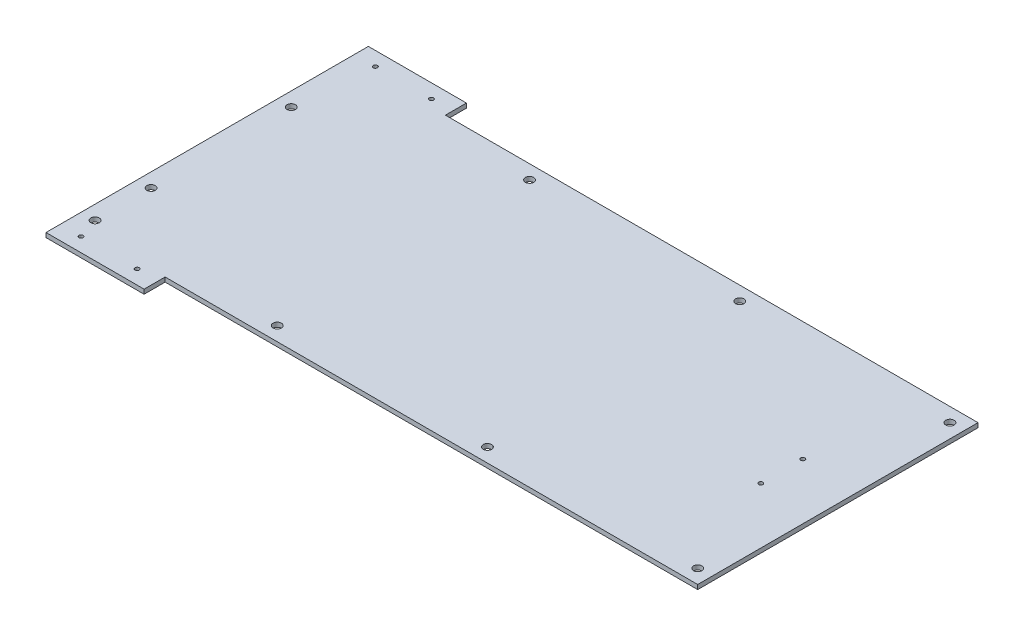
ISO-10303-21;
HEADER;
FILE_DESCRIPTION(('STEP AP214'),'2;1');
FILE_NAME('part.step','',(''),(''),'','','');
FILE_SCHEMA(('AUTOMOTIVE_DESIGN { 1 0 10303 214 1 1 1 1 }'));
ENDSEC;
DATA;
#1=APPLICATION_CONTEXT('core data for automotive mechanical design processes');
#2=APPLICATION_PROTOCOL_DEFINITION('international standard','automotive_design',2000,#1);
#3=PRODUCT_CONTEXT('',#1,'mechanical');
#4=PRODUCT('Part','Part','',(#3));
#5=PRODUCT_RELATED_PRODUCT_CATEGORY('part','',(#4));
#6=PRODUCT_DEFINITION_FORMATION('','',#4);
#7=PRODUCT_DEFINITION_CONTEXT('part definition',#1,'design');
#8=PRODUCT_DEFINITION('design','',#6,#7);
#9=PRODUCT_DEFINITION_SHAPE('','',#8);
#10=(LENGTH_UNIT() NAMED_UNIT(*) SI_UNIT(.MILLI.,.METRE.));
#11=(NAMED_UNIT(*) PLANE_ANGLE_UNIT() SI_UNIT($,.RADIAN.));
#12=(NAMED_UNIT(*) SI_UNIT($,.STERADIAN.) SOLID_ANGLE_UNIT());
#13=UNCERTAINTY_MEASURE_WITH_UNIT(LENGTH_MEASURE(1.E-05),#10,'distance_accuracy_value','');
#14=(GEOMETRIC_REPRESENTATION_CONTEXT(3) GLOBAL_UNCERTAINTY_ASSIGNED_CONTEXT((#13)) GLOBAL_UNIT_ASSIGNED_CONTEXT((#10,
#11,#12)) REPRESENTATION_CONTEXT('',''));
#15=CARTESIAN_POINT('',(0.,0.,0.));
#16=DIRECTION('',(0.,0.,1.));
#17=DIRECTION('',(1.,0.,0.));
#18=AXIS2_PLACEMENT_3D('',#15,#16,#17);
#19=CARTESIAN_POINT('',(0.,3.175,0.));
#20=DIRECTION('',(0.,-1.,0.));
#21=DIRECTION('',(0.,0.,-1.));
#22=AXIS2_PLACEMENT_3D('',#19,#20,#21);
#23=PLANE('',#22);
#24=DIRECTION('',(0.,0.,-1.));
#25=VECTOR('',#24,1.);
#26=CARTESIAN_POINT('',(450.,3.175,-110.468098834596));
#27=LINE('',#26,#25);
#28=CARTESIAN_POINT('',(450.,3.175,-110.468098834596));
#29=VERTEX_POINT('',#28);
#30=CARTESIAN_POINT('',(450.,3.175,-310.468098834596));
#31=VERTEX_POINT('',#30);
#32=EDGE_CURVE('E148',#29,#31,#27,.T.);
#33=ORIENTED_EDGE('',*,*,#32,.T.);
#34=DIRECTION('',(-1.,0.,0.));
#35=VECTOR('',#34,1.);
#36=CARTESIAN_POINT('',(70.,3.175,-310.468098834596));
#37=LINE('',#36,#35);
#38=CARTESIAN_POINT('',(70.,3.175,-310.468098834596));
#39=VERTEX_POINT('',#38);
#40=EDGE_CURVE('E96',#31,#39,#37,.T.);
#41=ORIENTED_EDGE('',*,*,#40,.T.);
#42=DIRECTION('',(0.,0.,-1.));
#43=VECTOR('',#42,1.);
#44=CARTESIAN_POINT('',(70.,3.175,-325.468098834596));
#45=LINE('',#44,#43);
#46=CARTESIAN_POINT('',(70.,3.175,-325.468098834596));
#47=VERTEX_POINT('',#46);
#48=EDGE_CURVE('E163',#39,#47,#45,.T.);
#49=ORIENTED_EDGE('',*,*,#48,.T.);
#50=DIRECTION('',(-1.,0.,0.));
#51=VECTOR('',#50,1.);
#52=CARTESIAN_POINT('',(0.,3.175,-325.468098834596));
#53=LINE('',#52,#51);
#54=CARTESIAN_POINT('',(0.,3.175,-325.468098834596));
#55=VERTEX_POINT('',#54);
#56=EDGE_CURVE('E176',#47,#55,#53,.T.);
#57=ORIENTED_EDGE('',*,*,#56,.T.);
#58=DIRECTION('',(0.,0.,1.));
#59=VECTOR('',#58,1.);
#60=CARTESIAN_POINT('',(0.,3.175,-95.4680988345958));
#61=LINE('',#60,#59);
#62=CARTESIAN_POINT('',(0.,3.175,-95.4680988345958));
#63=VERTEX_POINT('',#62);
#64=EDGE_CURVE('E115',#55,#63,#61,.T.);
#65=ORIENTED_EDGE('',*,*,#64,.T.);
#66=DIRECTION('',(1.,0.,0.));
#67=VECTOR('',#66,1.);
#68=CARTESIAN_POINT('',(0.,3.175,-95.4680988345958));
#69=LINE('',#68,#67);
#70=CARTESIAN_POINT('',(70.,3.175,-95.4680988345958));
#71=VERTEX_POINT('',#70);
#72=EDGE_CURVE('E109',#63,#71,#69,.T.);
#73=ORIENTED_EDGE('',*,*,#72,.T.);
#74=DIRECTION('',(0.,0.,-1.));
#75=VECTOR('',#74,1.);
#76=CARTESIAN_POINT('',(70.,3.175,-95.4680988345958));
#77=LINE('',#76,#75);
#78=CARTESIAN_POINT('',(70.,3.175,-110.468098834596));
#79=VERTEX_POINT('',#78);
#80=EDGE_CURVE('E113',#71,#79,#77,.T.);
#81=ORIENTED_EDGE('',*,*,#80,.T.);
#82=DIRECTION('',(1.,0.,0.));
#83=VECTOR('',#82,1.);
#84=CARTESIAN_POINT('',(70.,3.175,-110.468098834596));
#85=LINE('',#84,#83);
#86=EDGE_CURVE('E53',#79,#29,#85,.T.);
#87=ORIENTED_EDGE('',*,*,#86,.T.);
#88=EDGE_LOOP('',(#33,#41,#49,#57,#65,#73,#81,#87));
#89=FACE_BOUND('',#88,.T.);
#90=CARTESIAN_POINT('',(55.,3.175,-315.468098834596));
#91=DIRECTION('',(0.,1.,0.));
#92=DIRECTION('',(0.,0.,1.));
#93=AXIS2_PLACEMENT_3D('',#90,#91,#92);
#94=CIRCLE('',#93,1.5);
#95=CARTESIAN_POINT('',(55.,3.175,-313.968098834596));
#96=VERTEX_POINT('',#95);
#97=EDGE_CURVE('E137',#96,#96,#94,.T.);
#98=ORIENTED_EDGE('',*,*,#97,.F.);
#99=EDGE_LOOP('',(#98));
#100=FACE_BOUND('',#99,.T.);
#101=CARTESIAN_POINT('',(15.,3.175,-315.468098834596));
#102=DIRECTION('',(0.,1.,0.));
#103=DIRECTION('',(0.,0.,1.));
#104=AXIS2_PLACEMENT_3D('',#101,#102,#103);
#105=CIRCLE('',#104,1.5);
#106=CARTESIAN_POINT('',(15.,3.175,-313.968098834596));
#107=VERTEX_POINT('',#106);
#108=EDGE_CURVE('E185',#107,#107,#105,.T.);
#109=ORIENTED_EDGE('',*,*,#108,.F.);
#110=EDGE_LOOP('',(#109));
#111=FACE_BOUND('',#110,.T.);
#112=CARTESIAN_POINT('',(55.,3.175,-105.468098834596));
#113=DIRECTION('',(0.,1.,0.));
#114=DIRECTION('',(0.,0.,1.));
#115=AXIS2_PLACEMENT_3D('',#112,#113,#114);
#116=CIRCLE('',#115,1.5);
#117=CARTESIAN_POINT('',(55.,3.175,-103.968098834596));
#118=VERTEX_POINT('',#117);
#119=EDGE_CURVE('E191',#118,#118,#116,.T.);
#120=ORIENTED_EDGE('',*,*,#119,.F.);
#121=EDGE_LOOP('',(#120));
#122=FACE_BOUND('',#121,.T.);
#123=CARTESIAN_POINT('',(15.,3.175,-105.468098834596));
#124=DIRECTION('',(0.,1.,0.));
#125=DIRECTION('',(0.,0.,1.));
#126=AXIS2_PLACEMENT_3D('',#123,#124,#125);
#127=CIRCLE('',#126,1.5);
#128=CARTESIAN_POINT('',(15.,3.175,-103.968098834596));
#129=VERTEX_POINT('',#128);
#130=EDGE_CURVE('E197',#129,#129,#127,.T.);
#131=ORIENTED_EDGE('',*,*,#130,.F.);
#132=EDGE_LOOP('',(#131));
#133=FACE_BOUND('',#132,.T.);
#134=CARTESIAN_POINT('',(410.,3.175,-225.468098834596));
#135=DIRECTION('',(0.,1.,0.));
#136=DIRECTION('',(0.,0.,1.));
#137=AXIS2_PLACEMENT_3D('',#134,#135,#136);
#138=CIRCLE('',#137,1.50000000000002);
#139=CARTESIAN_POINT('',(410.,3.175,-223.968098834596));
#140=VERTEX_POINT('',#139);
#141=EDGE_CURVE('E203',#140,#140,#138,.T.);
#142=ORIENTED_EDGE('',*,*,#141,.F.);
#143=EDGE_LOOP('',(#142));
#144=FACE_BOUND('',#143,.T.);
#145=CARTESIAN_POINT('',(410.,3.175,-195.468098834596));
#146=DIRECTION('',(0.,1.,0.));
#147=DIRECTION('',(0.,0.,1.));
#148=AXIS2_PLACEMENT_3D('',#145,#146,#147);
#149=CIRCLE('',#148,1.50000000000002);
#150=CARTESIAN_POINT('',(410.,3.175,-193.968098834596));
#151=VERTEX_POINT('',#150);
#152=EDGE_CURVE('E209',#151,#151,#149,.T.);
#153=ORIENTED_EDGE('',*,*,#152,.F.);
#154=EDGE_LOOP('',(#153));
#155=FACE_BOUND('',#154,.T.);
#156=CARTESIAN_POINT('',(10.,3.175,-260.468098834596));
#157=DIRECTION('',(0.,1.,0.));
#158=DIRECTION('',(0.,0.,1.));
#159=AXIS2_PLACEMENT_3D('',#156,#157,#158);
#160=CIRCLE('',#159,3.);
#161=CARTESIAN_POINT('',(10.,3.175,-257.468098834596));
#162=VERTEX_POINT('',#161);
#163=EDGE_CURVE('E215',#162,#162,#160,.T.);
#164=ORIENTED_EDGE('',*,*,#163,.F.);
#165=EDGE_LOOP('',(#164));
#166=FACE_BOUND('',#165,.T.);
#167=CARTESIAN_POINT('',(440.,3.175,-300.468098834596));
#168=DIRECTION('',(0.,1.,0.));
#169=DIRECTION('',(0.,0.,1.));
#170=AXIS2_PLACEMENT_3D('',#167,#168,#169);
#171=CIRCLE('',#170,2.99999999999999);
#172=CARTESIAN_POINT('',(440.,3.175,-297.468098834596));
#173=VERTEX_POINT('',#172);
#174=EDGE_CURVE('E221',#173,#173,#171,.T.);
#175=ORIENTED_EDGE('',*,*,#174,.F.);
#176=EDGE_LOOP('',(#175));
#177=FACE_BOUND('',#176,.T.);
#178=CARTESIAN_POINT('',(140.,3.175,-300.468098834596));
#179=DIRECTION('',(0.,1.,0.));
#180=DIRECTION('',(0.,0.,1.));
#181=AXIS2_PLACEMENT_3D('',#178,#179,#180);
#182=CIRCLE('',#181,2.99999999999999);
#183=CARTESIAN_POINT('',(140.,3.175,-297.468098834596));
#184=VERTEX_POINT('',#183);
#185=EDGE_CURVE('E227',#184,#184,#182,.T.);
#186=ORIENTED_EDGE('',*,*,#185,.F.);
#187=EDGE_LOOP('',(#186));
#188=FACE_BOUND('',#187,.T.);
#189=CARTESIAN_POINT('',(290.,3.175,-300.468098834596));
#190=DIRECTION('',(0.,1.,0.));
#191=DIRECTION('',(0.,0.,1.));
#192=AXIS2_PLACEMENT_3D('',#189,#190,#191);
#193=CIRCLE('',#192,2.99999999999999);
#194=CARTESIAN_POINT('',(290.,3.175,-297.468098834596));
#195=VERTEX_POINT('',#194);
#196=EDGE_CURVE('E233',#195,#195,#193,.T.);
#197=ORIENTED_EDGE('',*,*,#196,.F.);
#198=EDGE_LOOP('',(#197));
#199=FACE_BOUND('',#198,.T.);
#200=CARTESIAN_POINT('',(440.,3.175,-120.468098834596));
#201=DIRECTION('',(0.,1.,0.));
#202=DIRECTION('',(0.,0.,-1.));
#203=AXIS2_PLACEMENT_3D('',#200,#201,#202);
#204=CIRCLE('',#203,2.99999999999999);
#205=CARTESIAN_POINT('',(440.,3.175,-123.468098834596));
#206=VERTEX_POINT('',#205);
#207=EDGE_CURVE('E239',#206,#206,#204,.T.);
#208=ORIENTED_EDGE('',*,*,#207,.F.);
#209=EDGE_LOOP('',(#208));
#210=FACE_BOUND('',#209,.T.);
#211=CARTESIAN_POINT('',(290.,3.175,-120.468098834596));
#212=DIRECTION('',(0.,1.,0.));
#213=DIRECTION('',(0.,0.,-1.));
#214=AXIS2_PLACEMENT_3D('',#211,#212,#213);
#215=CIRCLE('',#214,2.99999999999999);
#216=CARTESIAN_POINT('',(290.,3.175,-123.468098834596));
#217=VERTEX_POINT('',#216);
#218=EDGE_CURVE('E245',#217,#217,#215,.T.);
#219=ORIENTED_EDGE('',*,*,#218,.F.);
#220=EDGE_LOOP('',(#219));
#221=FACE_BOUND('',#220,.T.);
#222=CARTESIAN_POINT('',(140.,3.175,-120.468098834596));
#223=DIRECTION('',(0.,1.,0.));
#224=DIRECTION('',(0.,0.,-1.));
#225=AXIS2_PLACEMENT_3D('',#222,#223,#224);
#226=CIRCLE('',#225,2.99999999999999);
#227=CARTESIAN_POINT('',(140.,3.175,-123.468098834596));
#228=VERTEX_POINT('',#227);
#229=EDGE_CURVE('E251',#228,#228,#226,.T.);
#230=ORIENTED_EDGE('',*,*,#229,.F.);
#231=EDGE_LOOP('',(#230));
#232=FACE_BOUND('',#231,.T.);
#233=CARTESIAN_POINT('',(9.99999999999999,3.175,-120.468098834596));
#234=DIRECTION('',(0.,1.,0.));
#235=DIRECTION('',(0.,0.,-1.));
#236=AXIS2_PLACEMENT_3D('',#233,#234,#235);
#237=CIRCLE('',#236,3.);
#238=CARTESIAN_POINT('',(9.99999999999999,3.175,-123.468098834596));
#239=VERTEX_POINT('',#238);
#240=EDGE_CURVE('E257',#239,#239,#237,.T.);
#241=ORIENTED_EDGE('',*,*,#240,.F.);
#242=EDGE_LOOP('',(#241));
#243=FACE_BOUND('',#242,.T.);
#244=CARTESIAN_POINT('',(10.,3.175,-160.468098834596));
#245=DIRECTION('',(0.,1.,0.));
#246=DIRECTION('',(0.,0.,-1.));
#247=AXIS2_PLACEMENT_3D('',#244,#245,#246);
#248=CIRCLE('',#247,3.);
#249=CARTESIAN_POINT('',(10.,3.175,-163.468098834596));
#250=VERTEX_POINT('',#249);
#251=EDGE_CURVE('E263',#250,#250,#248,.T.);
#252=ORIENTED_EDGE('',*,*,#251,.F.);
#253=EDGE_LOOP('',(#252));
#254=FACE_BOUND('',#253,.T.);
#255=ADVANCED_FACE('F36',(#89,#100,#111,#122,#133,#144,#155,#166,#177,#188,#199,#210,#221,#232,
#243,#254),#23,.F.);
#256=CARTESIAN_POINT('',(0.,0.,0.));
#257=DIRECTION('',(0.,-1.,0.));
#258=DIRECTION('',(0.,0.,-1.));
#259=AXIS2_PLACEMENT_3D('',#256,#257,#258);
#260=PLANE('',#259);
#261=CARTESIAN_POINT('',(9.99999999999999,0.,-120.468098834596));
#262=DIRECTION('',(0.,1.,0.));
#263=DIRECTION('',(0.,0.,-1.));
#264=AXIS2_PLACEMENT_3D('',#261,#262,#263);
#265=CIRCLE('',#264,3.);
#266=CARTESIAN_POINT('',(9.99999999999999,0.,-123.468098834596));
#267=VERTEX_POINT('',#266);
#268=EDGE_CURVE('E260',#267,#267,#265,.T.);
#269=ORIENTED_EDGE('',*,*,#268,.T.);
#270=EDGE_LOOP('',(#269));
#271=FACE_BOUND('',#270,.T.);
#272=CARTESIAN_POINT('',(290.,0.,-120.468098834596));
#273=DIRECTION('',(0.,1.,0.));
#274=DIRECTION('',(0.,0.,-1.));
#275=AXIS2_PLACEMENT_3D('',#272,#273,#274);
#276=CIRCLE('',#275,2.99999999999999);
#277=CARTESIAN_POINT('',(290.,0.,-123.468098834596));
#278=VERTEX_POINT('',#277);
#279=EDGE_CURVE('E248',#278,#278,#276,.T.);
#280=ORIENTED_EDGE('',*,*,#279,.T.);
#281=EDGE_LOOP('',(#280));
#282=FACE_BOUND('',#281,.T.);
#283=CARTESIAN_POINT('',(290.,0.,-300.468098834596));
#284=DIRECTION('',(0.,1.,0.));
#285=DIRECTION('',(0.,0.,1.));
#286=AXIS2_PLACEMENT_3D('',#283,#284,#285);
#287=CIRCLE('',#286,2.99999999999999);
#288=CARTESIAN_POINT('',(290.,0.,-297.468098834596));
#289=VERTEX_POINT('',#288);
#290=EDGE_CURVE('E236',#289,#289,#287,.T.);
#291=ORIENTED_EDGE('',*,*,#290,.T.);
#292=EDGE_LOOP('',(#291));
#293=FACE_BOUND('',#292,.T.);
#294=CARTESIAN_POINT('',(440.,0.,-300.468098834596));
#295=DIRECTION('',(0.,1.,0.));
#296=DIRECTION('',(0.,0.,1.));
#297=AXIS2_PLACEMENT_3D('',#294,#295,#296);
#298=CIRCLE('',#297,2.99999999999999);
#299=CARTESIAN_POINT('',(440.,0.,-297.468098834596));
#300=VERTEX_POINT('',#299);
#301=EDGE_CURVE('E224',#300,#300,#298,.T.);
#302=ORIENTED_EDGE('',*,*,#301,.T.);
#303=EDGE_LOOP('',(#302));
#304=FACE_BOUND('',#303,.T.);
#305=CARTESIAN_POINT('',(410.,0.,-195.468098834596));
#306=DIRECTION('',(0.,1.,0.));
#307=DIRECTION('',(0.,0.,1.));
#308=AXIS2_PLACEMENT_3D('',#305,#306,#307);
#309=CIRCLE('',#308,1.50000000000002);
#310=CARTESIAN_POINT('',(410.,0.,-193.968098834596));
#311=VERTEX_POINT('',#310);
#312=EDGE_CURVE('E212',#311,#311,#309,.T.);
#313=ORIENTED_EDGE('',*,*,#312,.T.);
#314=EDGE_LOOP('',(#313));
#315=FACE_BOUND('',#314,.T.);
#316=CARTESIAN_POINT('',(15.,0.,-105.468098834596));
#317=DIRECTION('',(0.,1.,0.));
#318=DIRECTION('',(0.,0.,1.));
#319=AXIS2_PLACEMENT_3D('',#316,#317,#318);
#320=CIRCLE('',#319,1.5);
#321=CARTESIAN_POINT('',(15.,0.,-103.968098834596));
#322=VERTEX_POINT('',#321);
#323=EDGE_CURVE('E200',#322,#322,#320,.T.);
#324=ORIENTED_EDGE('',*,*,#323,.T.);
#325=EDGE_LOOP('',(#324));
#326=FACE_BOUND('',#325,.T.);
#327=CARTESIAN_POINT('',(15.,0.,-315.468098834596));
#328=DIRECTION('',(0.,1.,0.));
#329=DIRECTION('',(0.,0.,1.));
#330=AXIS2_PLACEMENT_3D('',#327,#328,#329);
#331=CIRCLE('',#330,1.5);
#332=CARTESIAN_POINT('',(15.,0.,-313.968098834596));
#333=VERTEX_POINT('',#332);
#334=EDGE_CURVE('E188',#333,#333,#331,.T.);
#335=ORIENTED_EDGE('',*,*,#334,.T.);
#336=EDGE_LOOP('',(#335));
#337=FACE_BOUND('',#336,.T.);
#338=DIRECTION('',(0.,0.,-1.));
#339=VECTOR('',#338,1.);
#340=CARTESIAN_POINT('',(450.,0.,-110.468098834596));
#341=LINE('',#340,#339);
#342=CARTESIAN_POINT('',(450.,0.,-110.468098834596));
#343=VERTEX_POINT('',#342);
#344=CARTESIAN_POINT('',(450.,0.,-310.468098834596));
#345=VERTEX_POINT('',#344);
#346=EDGE_CURVE('E133',#343,#345,#341,.T.);
#347=ORIENTED_EDGE('',*,*,#346,.F.);
#348=DIRECTION('',(1.,0.,0.));
#349=VECTOR('',#348,1.);
#350=CARTESIAN_POINT('',(70.,0.,-110.468098834596));
#351=LINE('',#350,#349);
#352=CARTESIAN_POINT('',(70.,0.,-110.468098834596));
#353=VERTEX_POINT('',#352);
#354=EDGE_CURVE('E88',#353,#343,#351,.T.);
#355=ORIENTED_EDGE('',*,*,#354,.F.);
#356=DIRECTION('',(0.,0.,-1.));
#357=VECTOR('',#356,1.);
#358=CARTESIAN_POINT('',(70.,0.,-95.4680988345958));
#359=LINE('',#358,#357);
#360=CARTESIAN_POINT('',(70.,0.,-95.4680988345958));
#361=VERTEX_POINT('',#360);
#362=EDGE_CURVE('E82',#361,#353,#359,.T.);
#363=ORIENTED_EDGE('',*,*,#362,.F.);
#364=DIRECTION('',(1.,0.,0.));
#365=VECTOR('',#364,1.);
#366=CARTESIAN_POINT('',(0.,0.,-95.4680988345958));
#367=LINE('',#366,#365);
#368=CARTESIAN_POINT('',(0.,0.,-95.4680988345958));
#369=VERTEX_POINT('',#368);
#370=EDGE_CURVE('E123',#369,#361,#367,.T.);
#371=ORIENTED_EDGE('',*,*,#370,.F.);
#372=DIRECTION('',(0.,0.,1.));
#373=VECTOR('',#372,1.);
#374=CARTESIAN_POINT('',(0.,0.,-95.4680988345958));
#375=LINE('',#374,#373);
#376=CARTESIAN_POINT('',(0.,0.,-325.468098834596));
#377=VERTEX_POINT('',#376);
#378=EDGE_CURVE('E143',#377,#369,#375,.T.);
#379=ORIENTED_EDGE('',*,*,#378,.F.);
#380=DIRECTION('',(-1.,0.,0.));
#381=VECTOR('',#380,1.);
#382=CARTESIAN_POINT('',(0.,0.,-325.468098834596));
#383=LINE('',#382,#381);
#384=CARTESIAN_POINT('',(70.,0.,-325.468098834596));
#385=VERTEX_POINT('',#384);
#386=EDGE_CURVE('E141',#385,#377,#383,.T.);
#387=ORIENTED_EDGE('',*,*,#386,.F.);
#388=DIRECTION('',(0.,0.,-1.));
#389=VECTOR('',#388,1.);
#390=CARTESIAN_POINT('',(70.,0.,-325.468098834596));
#391=LINE('',#390,#389);
#392=CARTESIAN_POINT('',(70.,0.,-310.468098834596));
#393=VERTEX_POINT('',#392);
#394=EDGE_CURVE('E139',#393,#385,#391,.T.);
#395=ORIENTED_EDGE('',*,*,#394,.F.);
#396=DIRECTION('',(-1.,0.,0.));
#397=VECTOR('',#396,1.);
#398=CARTESIAN_POINT('',(70.,0.,-310.468098834596));
#399=LINE('',#398,#397);
#400=EDGE_CURVE('E136',#345,#393,#399,.T.);
#401=ORIENTED_EDGE('',*,*,#400,.F.);
#402=EDGE_LOOP('',(#347,#355,#363,#371,#379,#387,#395,#401));
#403=FACE_BOUND('',#402,.T.);
#404=CARTESIAN_POINT('',(55.,0.,-315.468098834596));
#405=DIRECTION('',(0.,1.,0.));
#406=DIRECTION('',(0.,0.,1.));
#407=AXIS2_PLACEMENT_3D('',#404,#405,#406);
#408=CIRCLE('',#407,1.5);
#409=CARTESIAN_POINT('',(55.,0.,-313.968098834596));
#410=VERTEX_POINT('',#409);
#411=EDGE_CURVE('E182',#410,#410,#408,.T.);
#412=ORIENTED_EDGE('',*,*,#411,.T.);
#413=EDGE_LOOP('',(#412));
#414=FACE_BOUND('',#413,.T.);
#415=CARTESIAN_POINT('',(55.,0.,-105.468098834596));
#416=DIRECTION('',(0.,1.,0.));
#417=DIRECTION('',(0.,0.,1.));
#418=AXIS2_PLACEMENT_3D('',#415,#416,#417);
#419=CIRCLE('',#418,1.5);
#420=CARTESIAN_POINT('',(55.,0.,-103.968098834596));
#421=VERTEX_POINT('',#420);
#422=EDGE_CURVE('E194',#421,#421,#419,.T.);
#423=ORIENTED_EDGE('',*,*,#422,.T.);
#424=EDGE_LOOP('',(#423));
#425=FACE_BOUND('',#424,.T.);
#426=CARTESIAN_POINT('',(410.,0.,-225.468098834596));
#427=DIRECTION('',(0.,1.,0.));
#428=DIRECTION('',(0.,0.,1.));
#429=AXIS2_PLACEMENT_3D('',#426,#427,#428);
#430=CIRCLE('',#429,1.50000000000002);
#431=CARTESIAN_POINT('',(410.,0.,-223.968098834596));
#432=VERTEX_POINT('',#431);
#433=EDGE_CURVE('E206',#432,#432,#430,.T.);
#434=ORIENTED_EDGE('',*,*,#433,.T.);
#435=EDGE_LOOP('',(#434));
#436=FACE_BOUND('',#435,.T.);
#437=CARTESIAN_POINT('',(10.,0.,-260.468098834596));
#438=DIRECTION('',(0.,1.,0.));
#439=DIRECTION('',(0.,0.,1.));
#440=AXIS2_PLACEMENT_3D('',#437,#438,#439);
#441=CIRCLE('',#440,3.);
#442=CARTESIAN_POINT('',(10.,0.,-257.468098834596));
#443=VERTEX_POINT('',#442);
#444=EDGE_CURVE('E218',#443,#443,#441,.T.);
#445=ORIENTED_EDGE('',*,*,#444,.T.);
#446=EDGE_LOOP('',(#445));
#447=FACE_BOUND('',#446,.T.);
#448=CARTESIAN_POINT('',(140.,0.,-300.468098834596));
#449=DIRECTION('',(0.,1.,0.));
#450=DIRECTION('',(0.,0.,1.));
#451=AXIS2_PLACEMENT_3D('',#448,#449,#450);
#452=CIRCLE('',#451,2.99999999999999);
#453=CARTESIAN_POINT('',(140.,0.,-297.468098834596));
#454=VERTEX_POINT('',#453);
#455=EDGE_CURVE('E230',#454,#454,#452,.T.);
#456=ORIENTED_EDGE('',*,*,#455,.T.);
#457=EDGE_LOOP('',(#456));
#458=FACE_BOUND('',#457,.T.);
#459=CARTESIAN_POINT('',(440.,0.,-120.468098834596));
#460=DIRECTION('',(0.,1.,0.));
#461=DIRECTION('',(0.,0.,-1.));
#462=AXIS2_PLACEMENT_3D('',#459,#460,#461);
#463=CIRCLE('',#462,2.99999999999999);
#464=CARTESIAN_POINT('',(440.,0.,-123.468098834596));
#465=VERTEX_POINT('',#464);
#466=EDGE_CURVE('E242',#465,#465,#463,.T.);
#467=ORIENTED_EDGE('',*,*,#466,.T.);
#468=EDGE_LOOP('',(#467));
#469=FACE_BOUND('',#468,.T.);
#470=CARTESIAN_POINT('',(140.,0.,-120.468098834596));
#471=DIRECTION('',(0.,1.,0.));
#472=DIRECTION('',(0.,0.,-1.));
#473=AXIS2_PLACEMENT_3D('',#470,#471,#472);
#474=CIRCLE('',#473,2.99999999999999);
#475=CARTESIAN_POINT('',(140.,0.,-123.468098834596));
#476=VERTEX_POINT('',#475);
#477=EDGE_CURVE('E254',#476,#476,#474,.T.);
#478=ORIENTED_EDGE('',*,*,#477,.T.);
#479=EDGE_LOOP('',(#478));
#480=FACE_BOUND('',#479,.T.);
#481=CARTESIAN_POINT('',(10.,0.,-160.468098834596));
#482=DIRECTION('',(0.,1.,0.));
#483=DIRECTION('',(0.,0.,-1.));
#484=AXIS2_PLACEMENT_3D('',#481,#482,#483);
#485=CIRCLE('',#484,3.);
#486=CARTESIAN_POINT('',(10.,0.,-163.468098834596));
#487=VERTEX_POINT('',#486);
#488=EDGE_CURVE('E266',#487,#487,#485,.T.);
#489=ORIENTED_EDGE('',*,*,#488,.T.);
#490=EDGE_LOOP('',(#489));
#491=FACE_BOUND('',#490,.T.);
#492=ADVANCED_FACE('F167',(#271,#282,#293,#304,#315,#326,#337,#403,#414,#425,#436,#447,#458,
#469,#480,#491),#260,.T.);
#493=CARTESIAN_POINT('',(450.,3.175,-110.468098834596));
#494=DIRECTION('',(-1.,0.,0.));
#495=DIRECTION('',(0.,0.,1.));
#496=AXIS2_PLACEMENT_3D('',#493,#494,#495);
#497=PLANE('',#496);
#498=ORIENTED_EDGE('',*,*,#346,.T.);
#499=DIRECTION('',(0.,-1.,0.));
#500=VECTOR('',#499,1.);
#501=CARTESIAN_POINT('',(450.,3.175,-310.468098834596));
#502=LINE('',#501,#500);
#503=EDGE_CURVE('E11',#31,#345,#502,.T.);
#504=ORIENTED_EDGE('',*,*,#503,.F.);
#505=ORIENTED_EDGE('',*,*,#32,.F.);
#506=DIRECTION('',(0.,-1.,0.));
#507=VECTOR('',#506,1.);
#508=CARTESIAN_POINT('',(450.,3.175,-110.468098834596));
#509=LINE('',#508,#507);
#510=EDGE_CURVE('E129',#29,#343,#509,.T.);
#511=ORIENTED_EDGE('',*,*,#510,.T.);
#512=EDGE_LOOP('',(#498,#504,#505,#511));
#513=FACE_BOUND('',#512,.T.);
#514=ADVANCED_FACE('F38',(#513),#497,.F.);
#515=CARTESIAN_POINT('',(70.,3.175,-310.468098834596));
#516=DIRECTION('',(0.,0.,1.));
#517=DIRECTION('',(1.,0.,0.));
#518=AXIS2_PLACEMENT_3D('',#515,#516,#517);
#519=PLANE('',#518);
#520=ORIENTED_EDGE('',*,*,#400,.T.);
#521=DIRECTION('',(0.,-1.,0.));
#522=VECTOR('',#521,1.);
#523=CARTESIAN_POINT('',(70.,3.175,-310.468098834596));
#524=LINE('',#523,#522);
#525=EDGE_CURVE('E45',#39,#393,#524,.T.);
#526=ORIENTED_EDGE('',*,*,#525,.F.);
#527=ORIENTED_EDGE('',*,*,#40,.F.);
#528=ORIENTED_EDGE('',*,*,#503,.T.);
#529=EDGE_LOOP('',(#520,#526,#527,#528));
#530=FACE_BOUND('',#529,.T.);
#531=ADVANCED_FACE('F298',(#530),#519,.F.);
#532=CARTESIAN_POINT('',(70.,3.175,-325.468098834596));
#533=DIRECTION('',(-1.,0.,0.));
#534=DIRECTION('',(0.,0.,1.));
#535=AXIS2_PLACEMENT_3D('',#532,#533,#534);
#536=PLANE('',#535);
#537=ORIENTED_EDGE('',*,*,#394,.T.);
#538=DIRECTION('',(0.,-1.,0.));
#539=VECTOR('',#538,1.);
#540=CARTESIAN_POINT('',(70.,3.175,-325.468098834596));
#541=LINE('',#540,#539);
#542=EDGE_CURVE('E155',#47,#385,#541,.T.);
#543=ORIENTED_EDGE('',*,*,#542,.F.);
#544=ORIENTED_EDGE('',*,*,#48,.F.);
#545=ORIENTED_EDGE('',*,*,#525,.T.);
#546=EDGE_LOOP('',(#537,#543,#544,#545));
#547=FACE_BOUND('',#546,.T.);
#548=ADVANCED_FACE('F161',(#547),#536,.F.);
#549=CARTESIAN_POINT('',(0.,3.175,-325.468098834596));
#550=DIRECTION('',(0.,0.,1.));
#551=DIRECTION('',(1.,0.,0.));
#552=AXIS2_PLACEMENT_3D('',#549,#550,#551);
#553=PLANE('',#552);
#554=ORIENTED_EDGE('',*,*,#386,.T.);
#555=DIRECTION('',(0.,-1.,0.));
#556=VECTOR('',#555,1.);
#557=CARTESIAN_POINT('',(0.,3.175,-325.468098834596));
#558=LINE('',#557,#556);
#559=EDGE_CURVE('E152',#55,#377,#558,.T.);
#560=ORIENTED_EDGE('',*,*,#559,.F.);
#561=ORIENTED_EDGE('',*,*,#56,.F.);
#562=ORIENTED_EDGE('',*,*,#542,.T.);
#563=EDGE_LOOP('',(#554,#560,#561,#562));
#564=FACE_BOUND('',#563,.T.);
#565=ADVANCED_FACE('F172',(#564),#553,.F.);
#566=CARTESIAN_POINT('',(0.,3.175,-95.4680988345958));
#567=DIRECTION('',(1.,0.,0.));
#568=DIRECTION('',(0.,0.,-1.));
#569=AXIS2_PLACEMENT_3D('',#566,#567,#568);
#570=PLANE('',#569);
#571=ORIENTED_EDGE('',*,*,#378,.T.);
#572=DIRECTION('',(0.,-1.,0.));
#573=VECTOR('',#572,1.);
#574=CARTESIAN_POINT('',(0.,3.175,-95.4680988345958));
#575=LINE('',#574,#573);
#576=EDGE_CURVE('E124',#63,#369,#575,.T.);
#577=ORIENTED_EDGE('',*,*,#576,.F.);
#578=ORIENTED_EDGE('',*,*,#64,.F.);
#579=ORIENTED_EDGE('',*,*,#559,.T.);
#580=EDGE_LOOP('',(#571,#577,#578,#579));
#581=FACE_BOUND('',#580,.T.);
#582=ADVANCED_FACE('F175',(#581),#570,.F.);
#583=CARTESIAN_POINT('',(0.,3.175,-95.4680988345958));
#584=DIRECTION('',(0.,0.,-1.));
#585=DIRECTION('',(-1.,0.,0.));
#586=AXIS2_PLACEMENT_3D('',#583,#584,#585);
#587=PLANE('',#586);
#588=ORIENTED_EDGE('',*,*,#370,.T.);
#589=DIRECTION('',(0.,-1.,0.));
#590=VECTOR('',#589,1.);
#591=CARTESIAN_POINT('',(70.,3.175,-95.4680988345958));
#592=LINE('',#591,#590);
#593=EDGE_CURVE('E120',#71,#361,#592,.T.);
#594=ORIENTED_EDGE('',*,*,#593,.F.);
#595=ORIENTED_EDGE('',*,*,#72,.F.);
#596=ORIENTED_EDGE('',*,*,#576,.T.);
#597=EDGE_LOOP('',(#588,#594,#595,#596));
#598=FACE_BOUND('',#597,.T.);
#599=ADVANCED_FACE('F121',(#598),#587,.F.);
#600=CARTESIAN_POINT('',(70.,3.175,-95.4680988345958));
#601=DIRECTION('',(-1.,0.,0.));
#602=DIRECTION('',(0.,0.,1.));
#603=AXIS2_PLACEMENT_3D('',#600,#601,#602);
#604=PLANE('',#603);
#605=ORIENTED_EDGE('',*,*,#362,.T.);
#606=DIRECTION('',(0.,-1.,0.));
#607=VECTOR('',#606,1.);
#608=CARTESIAN_POINT('',(70.,3.175,-110.468098834596));
#609=LINE('',#608,#607);
#610=EDGE_CURVE('E125',#79,#353,#609,.T.);
#611=ORIENTED_EDGE('',*,*,#610,.F.);
#612=ORIENTED_EDGE('',*,*,#80,.F.);
#613=ORIENTED_EDGE('',*,*,#593,.T.);
#614=EDGE_LOOP('',(#605,#611,#612,#613));
#615=FACE_BOUND('',#614,.T.);
#616=ADVANCED_FACE('F127',(#615),#604,.F.);
#617=CARTESIAN_POINT('',(70.,3.175,-110.468098834596));
#618=DIRECTION('',(0.,0.,-1.));
#619=DIRECTION('',(-1.,0.,0.));
#620=AXIS2_PLACEMENT_3D('',#617,#618,#619);
#621=PLANE('',#620);
#622=ORIENTED_EDGE('',*,*,#354,.T.);
#623=ORIENTED_EDGE('',*,*,#510,.F.);
#624=ORIENTED_EDGE('',*,*,#86,.F.);
#625=ORIENTED_EDGE('',*,*,#610,.T.);
#626=EDGE_LOOP('',(#622,#623,#624,#625));
#627=FACE_BOUND('',#626,.T.);
#628=ADVANCED_FACE('F286',(#627),#621,.F.);
#629=CARTESIAN_POINT('',(55.,3.175,-315.468098834596));
#630=DIRECTION('',(0.,-1.,0.));
#631=DIRECTION('',(0.,0.,-1.));
#632=AXIS2_PLACEMENT_3D('',#629,#630,#631);
#633=CYLINDRICAL_SURFACE('',#632,1.5);
#634=ORIENTED_EDGE('',*,*,#97,.T.);
#635=EDGE_LOOP('',(#634));
#636=FACE_BOUND('',#635,.T.);
#637=ORIENTED_EDGE('',*,*,#411,.F.);
#638=EDGE_LOOP('',(#637));
#639=FACE_BOUND('',#638,.T.);
#640=ADVANCED_FACE('F283',(#636,#639),#633,.F.);
#641=CARTESIAN_POINT('',(15.,3.175,-315.468098834596));
#642=DIRECTION('',(0.,-1.,0.));
#643=DIRECTION('',(0.,0.,-1.));
#644=AXIS2_PLACEMENT_3D('',#641,#642,#643);
#645=CYLINDRICAL_SURFACE('',#644,1.5);
#646=ORIENTED_EDGE('',*,*,#108,.T.);
#647=EDGE_LOOP('',(#646));
#648=FACE_BOUND('',#647,.T.);
#649=ORIENTED_EDGE('',*,*,#334,.F.);
#650=EDGE_LOOP('',(#649));
#651=FACE_BOUND('',#650,.T.);
#652=ADVANCED_FACE('F374',(#648,#651),#645,.F.);
#653=CARTESIAN_POINT('',(55.,3.175,-105.468098834596));
#654=DIRECTION('',(0.,-1.,0.));
#655=DIRECTION('',(0.,0.,-1.));
#656=AXIS2_PLACEMENT_3D('',#653,#654,#655);
#657=CYLINDRICAL_SURFACE('',#656,1.5);
#658=ORIENTED_EDGE('',*,*,#119,.T.);
#659=EDGE_LOOP('',(#658));
#660=FACE_BOUND('',#659,.T.);
#661=ORIENTED_EDGE('',*,*,#422,.F.);
#662=EDGE_LOOP('',(#661));
#663=FACE_BOUND('',#662,.T.);
#664=ADVANCED_FACE('F383',(#660,#663),#657,.F.);
#665=CARTESIAN_POINT('',(15.,3.175,-105.468098834596));
#666=DIRECTION('',(0.,-1.,0.));
#667=DIRECTION('',(0.,0.,-1.));
#668=AXIS2_PLACEMENT_3D('',#665,#666,#667);
#669=CYLINDRICAL_SURFACE('',#668,1.5);
#670=ORIENTED_EDGE('',*,*,#130,.T.);
#671=EDGE_LOOP('',(#670));
#672=FACE_BOUND('',#671,.T.);
#673=ORIENTED_EDGE('',*,*,#323,.F.);
#674=EDGE_LOOP('',(#673));
#675=FACE_BOUND('',#674,.T.);
#676=ADVANCED_FACE('F392',(#672,#675),#669,.F.);
#677=CARTESIAN_POINT('',(410.,3.175,-225.468098834596));
#678=DIRECTION('',(0.,-1.,0.));
#679=DIRECTION('',(0.,0.,-1.));
#680=AXIS2_PLACEMENT_3D('',#677,#678,#679);
#681=CYLINDRICAL_SURFACE('',#680,1.50000000000002);
#682=ORIENTED_EDGE('',*,*,#141,.T.);
#683=EDGE_LOOP('',(#682));
#684=FACE_BOUND('',#683,.T.);
#685=ORIENTED_EDGE('',*,*,#433,.F.);
#686=EDGE_LOOP('',(#685));
#687=FACE_BOUND('',#686,.T.);
#688=ADVANCED_FACE('F402',(#684,#687),#681,.F.);
#689=CARTESIAN_POINT('',(410.,3.175,-195.468098834596));
#690=DIRECTION('',(0.,-1.,0.));
#691=DIRECTION('',(0.,0.,-1.));
#692=AXIS2_PLACEMENT_3D('',#689,#690,#691);
#693=CYLINDRICAL_SURFACE('',#692,1.50000000000002);
#694=ORIENTED_EDGE('',*,*,#152,.T.);
#695=EDGE_LOOP('',(#694));
#696=FACE_BOUND('',#695,.T.);
#697=ORIENTED_EDGE('',*,*,#312,.F.);
#698=EDGE_LOOP('',(#697));
#699=FACE_BOUND('',#698,.T.);
#700=ADVANCED_FACE('F412',(#696,#699),#693,.F.);
#701=CARTESIAN_POINT('',(10.,3.175,-260.468098834596));
#702=DIRECTION('',(0.,-1.,0.));
#703=DIRECTION('',(0.,0.,-1.));
#704=AXIS2_PLACEMENT_3D('',#701,#702,#703);
#705=CYLINDRICAL_SURFACE('',#704,3.);
#706=ORIENTED_EDGE('',*,*,#163,.T.);
#707=EDGE_LOOP('',(#706));
#708=FACE_BOUND('',#707,.T.);
#709=ORIENTED_EDGE('',*,*,#444,.F.);
#710=EDGE_LOOP('',(#709));
#711=FACE_BOUND('',#710,.T.);
#712=ADVANCED_FACE('F422',(#708,#711),#705,.F.);
#713=CARTESIAN_POINT('',(440.,3.175,-300.468098834596));
#714=DIRECTION('',(0.,-1.,0.));
#715=DIRECTION('',(0.,0.,-1.));
#716=AXIS2_PLACEMENT_3D('',#713,#714,#715);
#717=CYLINDRICAL_SURFACE('',#716,2.99999999999999);
#718=ORIENTED_EDGE('',*,*,#174,.T.);
#719=EDGE_LOOP('',(#718));
#720=FACE_BOUND('',#719,.T.);
#721=ORIENTED_EDGE('',*,*,#301,.F.);
#722=EDGE_LOOP('',(#721));
#723=FACE_BOUND('',#722,.T.);
#724=ADVANCED_FACE('F432',(#720,#723),#717,.F.);
#725=CARTESIAN_POINT('',(140.,3.175,-300.468098834596));
#726=DIRECTION('',(0.,-1.,0.));
#727=DIRECTION('',(0.,0.,-1.));
#728=AXIS2_PLACEMENT_3D('',#725,#726,#727);
#729=CYLINDRICAL_SURFACE('',#728,2.99999999999999);
#730=ORIENTED_EDGE('',*,*,#185,.T.);
#731=EDGE_LOOP('',(#730));
#732=FACE_BOUND('',#731,.T.);
#733=ORIENTED_EDGE('',*,*,#455,.F.);
#734=EDGE_LOOP('',(#733));
#735=FACE_BOUND('',#734,.T.);
#736=ADVANCED_FACE('F442',(#732,#735),#729,.F.);
#737=CARTESIAN_POINT('',(290.,3.175,-300.468098834596));
#738=DIRECTION('',(0.,-1.,0.));
#739=DIRECTION('',(0.,0.,-1.));
#740=AXIS2_PLACEMENT_3D('',#737,#738,#739);
#741=CYLINDRICAL_SURFACE('',#740,2.99999999999999);
#742=ORIENTED_EDGE('',*,*,#196,.T.);
#743=EDGE_LOOP('',(#742));
#744=FACE_BOUND('',#743,.T.);
#745=ORIENTED_EDGE('',*,*,#290,.F.);
#746=EDGE_LOOP('',(#745));
#747=FACE_BOUND('',#746,.T.);
#748=ADVANCED_FACE('F452',(#744,#747),#741,.F.);
#749=CARTESIAN_POINT('',(440.,3.175,-120.468098834596));
#750=DIRECTION('',(0.,-1.,0.));
#751=DIRECTION('',(0.,0.,-1.));
#752=AXIS2_PLACEMENT_3D('',#749,#750,#751);
#753=CYLINDRICAL_SURFACE('',#752,2.99999999999999);
#754=ORIENTED_EDGE('',*,*,#207,.T.);
#755=EDGE_LOOP('',(#754));
#756=FACE_BOUND('',#755,.T.);
#757=ORIENTED_EDGE('',*,*,#466,.F.);
#758=EDGE_LOOP('',(#757));
#759=FACE_BOUND('',#758,.T.);
#760=ADVANCED_FACE('F462',(#756,#759),#753,.F.);
#761=CARTESIAN_POINT('',(290.,3.175,-120.468098834596));
#762=DIRECTION('',(0.,-1.,0.));
#763=DIRECTION('',(0.,0.,-1.));
#764=AXIS2_PLACEMENT_3D('',#761,#762,#763);
#765=CYLINDRICAL_SURFACE('',#764,2.99999999999999);
#766=ORIENTED_EDGE('',*,*,#218,.T.);
#767=EDGE_LOOP('',(#766));
#768=FACE_BOUND('',#767,.T.);
#769=ORIENTED_EDGE('',*,*,#279,.F.);
#770=EDGE_LOOP('',(#769));
#771=FACE_BOUND('',#770,.T.);
#772=ADVANCED_FACE('F472',(#768,#771),#765,.F.);
#773=CARTESIAN_POINT('',(140.,3.175,-120.468098834596));
#774=DIRECTION('',(0.,-1.,0.));
#775=DIRECTION('',(0.,0.,-1.));
#776=AXIS2_PLACEMENT_3D('',#773,#774,#775);
#777=CYLINDRICAL_SURFACE('',#776,2.99999999999999);
#778=ORIENTED_EDGE('',*,*,#229,.T.);
#779=EDGE_LOOP('',(#778));
#780=FACE_BOUND('',#779,.T.);
#781=ORIENTED_EDGE('',*,*,#477,.F.);
#782=EDGE_LOOP('',(#781));
#783=FACE_BOUND('',#782,.T.);
#784=ADVANCED_FACE('F482',(#780,#783),#777,.F.);
#785=CARTESIAN_POINT('',(9.99999999999999,3.175,-120.468098834596));
#786=DIRECTION('',(0.,-1.,0.));
#787=DIRECTION('',(0.,0.,-1.));
#788=AXIS2_PLACEMENT_3D('',#785,#786,#787);
#789=CYLINDRICAL_SURFACE('',#788,3.);
#790=ORIENTED_EDGE('',*,*,#240,.T.);
#791=EDGE_LOOP('',(#790));
#792=FACE_BOUND('',#791,.T.);
#793=ORIENTED_EDGE('',*,*,#268,.F.);
#794=EDGE_LOOP('',(#793));
#795=FACE_BOUND('',#794,.T.);
#796=ADVANCED_FACE('F492',(#792,#795),#789,.F.);
#797=CARTESIAN_POINT('',(10.,3.175,-160.468098834596));
#798=DIRECTION('',(0.,-1.,0.));
#799=DIRECTION('',(0.,0.,-1.));
#800=AXIS2_PLACEMENT_3D('',#797,#798,#799);
#801=CYLINDRICAL_SURFACE('',#800,3.);
#802=ORIENTED_EDGE('',*,*,#251,.T.);
#803=EDGE_LOOP('',(#802));
#804=FACE_BOUND('',#803,.T.);
#805=ORIENTED_EDGE('',*,*,#488,.F.);
#806=EDGE_LOOP('',(#805));
#807=FACE_BOUND('',#806,.T.);
#808=ADVANCED_FACE('F272',(#804,#807),#801,.F.);
#809=CLOSED_SHELL('',(#255,#492,#514,#531,#548,#565,#582,#599,#616,#628,#640,#652,#664,#676,
#688,#700,#712,#724,#736,#748,#760,#772,#784,#796,#808));
#810=MANIFOLD_SOLID_BREP('B2',#809);
#811=ADVANCED_BREP_SHAPE_REPRESENTATION('',(#18,#810),#14);
#812=SHAPE_DEFINITION_REPRESENTATION(#9,#811);
ENDSEC;
END-ISO-10303-21;
